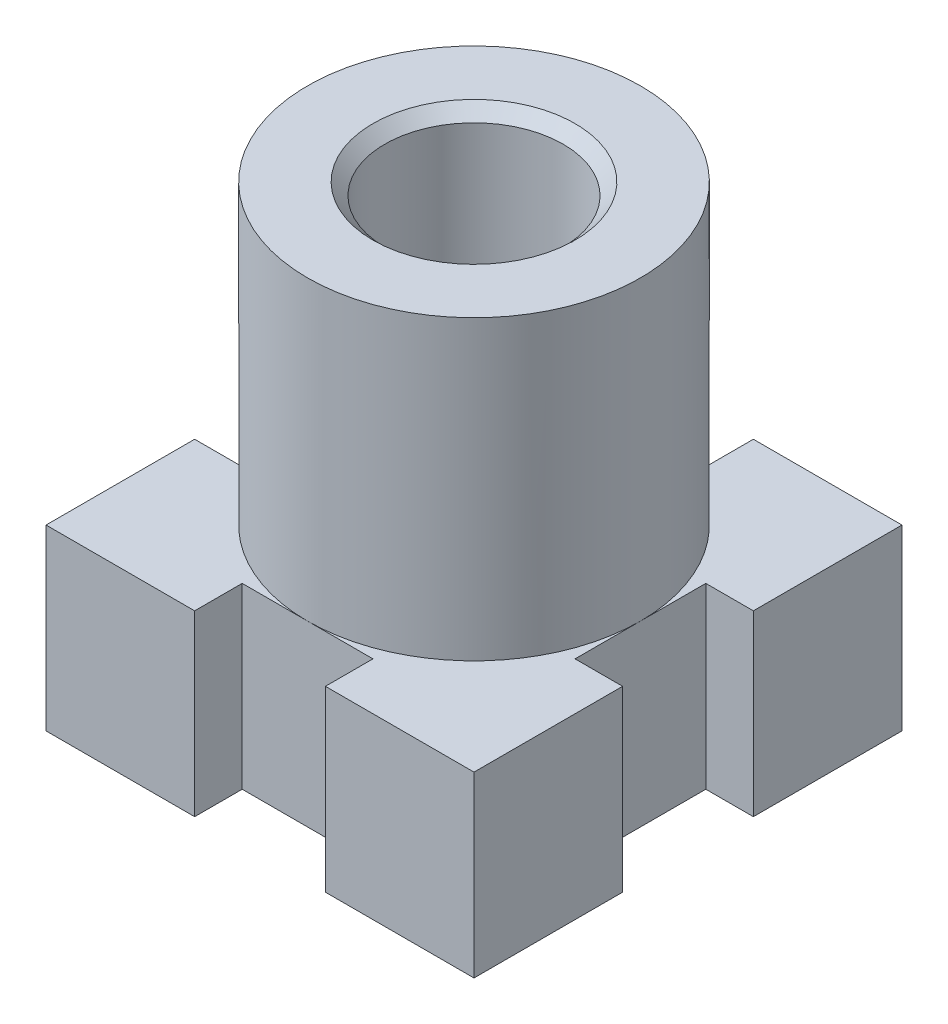
ISO-10303-21;
HEADER;
FILE_DESCRIPTION(('STEP AP214'),'2;1');
FILE_NAME('part.step','',(''),(''),'','','');
FILE_SCHEMA(('AUTOMOTIVE_DESIGN { 1 0 10303 214 1 1 1 1 }'));
ENDSEC;
DATA;
#1=APPLICATION_CONTEXT('core data for automotive mechanical design processes');
#2=APPLICATION_PROTOCOL_DEFINITION('international standard','automotive_design',2000,#1);
#3=PRODUCT_CONTEXT('',#1,'mechanical');
#4=PRODUCT('Part','Part','',(#3));
#5=PRODUCT_RELATED_PRODUCT_CATEGORY('part','',(#4));
#6=PRODUCT_DEFINITION_FORMATION('','',#4);
#7=PRODUCT_DEFINITION_CONTEXT('part definition',#1,'design');
#8=PRODUCT_DEFINITION('design','',#6,#7);
#9=PRODUCT_DEFINITION_SHAPE('','',#8);
#10=(LENGTH_UNIT() NAMED_UNIT(*) SI_UNIT(.MILLI.,.METRE.));
#11=(NAMED_UNIT(*) PLANE_ANGLE_UNIT() SI_UNIT($,.RADIAN.));
#12=(NAMED_UNIT(*) SI_UNIT($,.STERADIAN.) SOLID_ANGLE_UNIT());
#13=UNCERTAINTY_MEASURE_WITH_UNIT(LENGTH_MEASURE(1.E-05),#10,'distance_accuracy_value','');
#14=(GEOMETRIC_REPRESENTATION_CONTEXT(3) GLOBAL_UNCERTAINTY_ASSIGNED_CONTEXT((#13)) GLOBAL_UNIT_ASSIGNED_CONTEXT((#10,
#11,#12)) REPRESENTATION_CONTEXT('',''));
#15=CARTESIAN_POINT('',(0.,0.,0.));
#16=DIRECTION('',(0.,0.,1.));
#17=DIRECTION('',(1.,0.,0.));
#18=AXIS2_PLACEMENT_3D('',#15,#16,#17);
#19=CARTESIAN_POINT('',(0.,7.62,0.));
#20=DIRECTION('',(0.,1.,0.));
#21=DIRECTION('',(0.,0.,1.));
#22=AXIS2_PLACEMENT_3D('',#19,#20,#21);
#23=PLANE('',#22);
#24=CARTESIAN_POINT('',(0.,7.62,0.));
#25=DIRECTION('',(0.,1.,0.));
#26=DIRECTION('',(0.,0.,1.));
#27=AXIS2_PLACEMENT_3D('',#24,#25,#26);
#28=CIRCLE('',#27,7.112);
#29=CARTESIAN_POINT('',(0.,7.62,7.112));
#30=VERTEX_POINT('',#29);
#31=CARTESIAN_POINT('',(7.112,7.62,0.));
#32=VERTEX_POINT('',#31);
#33=EDGE_CURVE('E208',#30,#32,#28,.T.);
#34=ORIENTED_EDGE('',*,*,#33,.F.);
#35=DIRECTION('',(1.,0.,0.));
#36=VECTOR('',#35,1.);
#37=CARTESIAN_POINT('',(2.794,7.62,7.112));
#38=LINE('',#37,#36);
#39=CARTESIAN_POINT('',(2.794,7.62,7.112));
#40=VERTEX_POINT('',#39);
#41=EDGE_CURVE('E197',#30,#40,#38,.T.);
#42=ORIENTED_EDGE('',*,*,#41,.T.);
#43=DIRECTION('',(0.,0.,1.));
#44=VECTOR('',#43,1.);
#45=CARTESIAN_POINT('',(2.794,7.62,9.144));
#46=LINE('',#45,#44);
#47=CARTESIAN_POINT('',(2.794,7.62,9.144));
#48=VERTEX_POINT('',#47);
#49=EDGE_CURVE('E196',#40,#48,#46,.T.);
#50=ORIENTED_EDGE('',*,*,#49,.T.);
#51=DIRECTION('',(1.,0.,0.));
#52=VECTOR('',#51,1.);
#53=CARTESIAN_POINT('',(2.794,7.62,9.144));
#54=LINE('',#53,#52);
#55=CARTESIAN_POINT('',(9.14399999999999,7.62,9.144));
#56=VERTEX_POINT('',#55);
#57=EDGE_CURVE('E256',#48,#56,#54,.T.);
#58=ORIENTED_EDGE('',*,*,#57,.T.);
#59=DIRECTION('',(0.,0.,-1.));
#60=VECTOR('',#59,1.);
#61=CARTESIAN_POINT('',(9.14399999999999,7.62,9.144));
#62=LINE('',#61,#60);
#63=CARTESIAN_POINT('',(9.144,7.62,2.794));
#64=VERTEX_POINT('',#63);
#65=EDGE_CURVE('E258',#56,#64,#62,.T.);
#66=ORIENTED_EDGE('',*,*,#65,.T.);
#67=DIRECTION('',(-1.,0.,0.));
#68=VECTOR('',#67,1.);
#69=CARTESIAN_POINT('',(7.112,7.62,2.794));
#70=LINE('',#69,#68);
#71=CARTESIAN_POINT('',(7.112,7.62,2.794));
#72=VERTEX_POINT('',#71);
#73=EDGE_CURVE('E260',#64,#72,#70,.T.);
#74=ORIENTED_EDGE('',*,*,#73,.T.);
#75=DIRECTION('',(0.,0.,-1.));
#76=VECTOR('',#75,1.);
#77=CARTESIAN_POINT('',(7.112,7.62,-2.794));
#78=LINE('',#77,#76);
#79=EDGE_CURVE('E210',#72,#32,#78,.T.);
#80=ORIENTED_EDGE('',*,*,#79,.T.);
#81=EDGE_LOOP('',(#34,#42,#50,#58,#66,#74,#80));
#82=FACE_BOUND('',#81,.T.);
#83=ADVANCED_FACE('F39',(#82),#23,.T.);
#84=CARTESIAN_POINT('',(0.,7.62,-7.112));
#85=VERTEX_POINT('',#84);
#86=EDGE_CURVE('E55',#32,#85,#28,.T.);
#87=ORIENTED_EDGE('',*,*,#86,.F.);
#88=CARTESIAN_POINT('',(7.112,7.62,-2.794));
#89=VERTEX_POINT('',#88);
#90=EDGE_CURVE('E262',#32,#89,#78,.T.);
#91=ORIENTED_EDGE('',*,*,#90,.T.);
#92=DIRECTION('',(1.,0.,0.));
#93=VECTOR('',#92,1.);
#94=CARTESIAN_POINT('',(9.144,7.62,-2.794));
#95=LINE('',#94,#93);
#96=CARTESIAN_POINT('',(9.144,7.62,-2.794));
#97=VERTEX_POINT('',#96);
#98=EDGE_CURVE('E264',#89,#97,#95,.T.);
#99=ORIENTED_EDGE('',*,*,#98,.T.);
#100=DIRECTION('',(0.,0.,-1.));
#101=VECTOR('',#100,1.);
#102=CARTESIAN_POINT('',(9.144,7.62,-2.794));
#103=LINE('',#102,#101);
#104=CARTESIAN_POINT('',(9.144,7.62,-9.144));
#105=VERTEX_POINT('',#104);
#106=EDGE_CURVE('E225',#97,#105,#103,.T.);
#107=ORIENTED_EDGE('',*,*,#106,.T.);
#108=DIRECTION('',(-1.,0.,0.));
#109=VECTOR('',#108,1.);
#110=CARTESIAN_POINT('',(9.144,7.62,-9.144));
#111=LINE('',#110,#109);
#112=CARTESIAN_POINT('',(2.794,7.62,-9.144));
#113=VERTEX_POINT('',#112);
#114=EDGE_CURVE('E228',#105,#113,#111,.T.);
#115=ORIENTED_EDGE('',*,*,#114,.T.);
#116=DIRECTION('',(0.,0.,1.));
#117=VECTOR('',#116,1.);
#118=CARTESIAN_POINT('',(2.794,7.62,-7.112));
#119=LINE('',#118,#117);
#120=CARTESIAN_POINT('',(2.794,7.62,-7.112));
#121=VERTEX_POINT('',#120);
#122=EDGE_CURVE('E231',#113,#121,#119,.T.);
#123=ORIENTED_EDGE('',*,*,#122,.T.);
#124=DIRECTION('',(-1.,0.,0.));
#125=VECTOR('',#124,1.);
#126=CARTESIAN_POINT('',(-2.794,7.62,-7.112));
#127=LINE('',#126,#125);
#128=EDGE_CURVE('E234',#121,#85,#127,.T.);
#129=ORIENTED_EDGE('',*,*,#128,.T.);
#130=EDGE_LOOP('',(#87,#91,#99,#107,#115,#123,#129));
#131=FACE_BOUND('',#130,.T.);
#132=ADVANCED_FACE('F375',(#131),#23,.T.);
#133=CARTESIAN_POINT('',(-7.112,7.62,0.));
#134=VERTEX_POINT('',#133);
#135=EDGE_CURVE('E217',#85,#134,#28,.T.);
#136=ORIENTED_EDGE('',*,*,#135,.F.);
#137=CARTESIAN_POINT('',(-2.794,7.62,-7.112));
#138=VERTEX_POINT('',#137);
#139=EDGE_CURVE('E233',#85,#138,#127,.T.);
#140=ORIENTED_EDGE('',*,*,#139,.T.);
#141=DIRECTION('',(0.,0.,-1.));
#142=VECTOR('',#141,1.);
#143=CARTESIAN_POINT('',(-2.794,7.62,-9.144));
#144=LINE('',#143,#142);
#145=CARTESIAN_POINT('',(-2.794,7.62,-9.144));
#146=VERTEX_POINT('',#145);
#147=EDGE_CURVE('E236',#138,#146,#144,.T.);
#148=ORIENTED_EDGE('',*,*,#147,.T.);
#149=DIRECTION('',(-1.,0.,0.));
#150=VECTOR('',#149,1.);
#151=CARTESIAN_POINT('',(-2.794,7.62,-9.144));
#152=LINE('',#151,#150);
#153=CARTESIAN_POINT('',(-9.144,7.62,-9.144));
#154=VERTEX_POINT('',#153);
#155=EDGE_CURVE('E238',#146,#154,#152,.T.);
#156=ORIENTED_EDGE('',*,*,#155,.T.);
#157=DIRECTION('',(0.,0.,1.));
#158=VECTOR('',#157,1.);
#159=CARTESIAN_POINT('',(-9.144,7.62,-9.144));
#160=LINE('',#159,#158);
#161=CARTESIAN_POINT('',(-9.144,7.62,-2.794));
#162=VERTEX_POINT('',#161);
#163=EDGE_CURVE('E240',#154,#162,#160,.T.);
#164=ORIENTED_EDGE('',*,*,#163,.T.);
#165=DIRECTION('',(1.,0.,0.));
#166=VECTOR('',#165,1.);
#167=CARTESIAN_POINT('',(-7.112,7.62,-2.794));
#168=LINE('',#167,#166);
#169=CARTESIAN_POINT('',(-7.112,7.62,-2.794));
#170=VERTEX_POINT('',#169);
#171=EDGE_CURVE('E242',#162,#170,#168,.T.);
#172=ORIENTED_EDGE('',*,*,#171,.T.);
#173=DIRECTION('',(0.,0.,1.));
#174=VECTOR('',#173,1.);
#175=CARTESIAN_POINT('',(-7.112,7.62,2.794));
#176=LINE('',#175,#174);
#177=EDGE_CURVE('E245',#170,#134,#176,.T.);
#178=ORIENTED_EDGE('',*,*,#177,.T.);
#179=EDGE_LOOP('',(#136,#140,#148,#156,#164,#172,#178));
#180=FACE_BOUND('',#179,.T.);
#181=ADVANCED_FACE('F372',(#180),#23,.T.);
#182=CARTESIAN_POINT('',(9.144,7.62,-2.794));
#183=DIRECTION('',(-1.,0.,0.));
#184=DIRECTION('',(0.,0.,1.));
#185=AXIS2_PLACEMENT_3D('',#182,#183,#184);
#186=PLANE('',#185);
#187=DIRECTION('',(0.,0.,-1.));
#188=VECTOR('',#187,1.);
#189=CARTESIAN_POINT('',(9.144,0.,-2.794));
#190=LINE('',#189,#188);
#191=CARTESIAN_POINT('',(9.144,0.,-2.794));
#192=VERTEX_POINT('',#191);
#193=CARTESIAN_POINT('',(9.144,0.,-9.144));
#194=VERTEX_POINT('',#193);
#195=EDGE_CURVE('E267',#192,#194,#190,.T.);
#196=ORIENTED_EDGE('',*,*,#195,.T.);
#197=DIRECTION('',(0.,-1.,0.));
#198=VECTOR('',#197,1.);
#199=CARTESIAN_POINT('',(9.144,7.62,-9.144));
#200=LINE('',#199,#198);
#201=EDGE_CURVE('E218',#105,#194,#200,.T.);
#202=ORIENTED_EDGE('',*,*,#201,.F.);
#203=ORIENTED_EDGE('',*,*,#106,.F.);
#204=DIRECTION('',(0.,-1.,0.));
#205=VECTOR('',#204,1.);
#206=CARTESIAN_POINT('',(9.144,7.62,-2.794));
#207=LINE('',#206,#205);
#208=EDGE_CURVE('E266',#97,#192,#207,.T.);
#209=ORIENTED_EDGE('',*,*,#208,.T.);
#210=EDGE_LOOP('',(#196,#202,#203,#209));
#211=FACE_BOUND('',#210,.T.);
#212=ADVANCED_FACE('F463',(#211),#186,.F.);
#213=CARTESIAN_POINT('',(9.144,7.62,-9.144));
#214=DIRECTION('',(0.,0.,1.));
#215=DIRECTION('',(1.,0.,0.));
#216=AXIS2_PLACEMENT_3D('',#213,#214,#215);
#217=PLANE('',#216);
#218=DIRECTION('',(-1.,0.,0.));
#219=VECTOR('',#218,1.);
#220=CARTESIAN_POINT('',(9.144,0.,-9.144));
#221=LINE('',#220,#219);
#222=CARTESIAN_POINT('',(2.794,0.,-9.144));
#223=VERTEX_POINT('',#222);
#224=EDGE_CURVE('E270',#194,#223,#221,.T.);
#225=ORIENTED_EDGE('',*,*,#224,.T.);
#226=DIRECTION('',(0.,-1.,0.));
#227=VECTOR('',#226,1.);
#228=CARTESIAN_POINT('',(2.794,7.62,-9.144));
#229=LINE('',#228,#227);
#230=EDGE_CURVE('E220',#113,#223,#229,.T.);
#231=ORIENTED_EDGE('',*,*,#230,.F.);
#232=ORIENTED_EDGE('',*,*,#114,.F.);
#233=ORIENTED_EDGE('',*,*,#201,.T.);
#234=EDGE_LOOP('',(#225,#231,#232,#233));
#235=FACE_BOUND('',#234,.T.);
#236=ADVANCED_FACE('F460',(#235),#217,.F.);
#237=CARTESIAN_POINT('',(2.794,7.62,-7.112));
#238=DIRECTION('',(1.,0.,0.));
#239=DIRECTION('',(0.,0.,-1.));
#240=AXIS2_PLACEMENT_3D('',#237,#238,#239);
#241=PLANE('',#240);
#242=DIRECTION('',(0.,0.,1.));
#243=VECTOR('',#242,1.);
#244=CARTESIAN_POINT('',(2.794,0.,-7.112));
#245=LINE('',#244,#243);
#246=CARTESIAN_POINT('',(2.794,0.,-7.112));
#247=VERTEX_POINT('',#246);
#248=EDGE_CURVE('E272',#223,#247,#245,.T.);
#249=ORIENTED_EDGE('',*,*,#248,.T.);
#250=DIRECTION('',(0.,-1.,0.));
#251=VECTOR('',#250,1.);
#252=CARTESIAN_POINT('',(2.794,7.62,-7.112));
#253=LINE('',#252,#251);
#254=EDGE_CURVE('E354',#121,#247,#253,.T.);
#255=ORIENTED_EDGE('',*,*,#254,.F.);
#256=ORIENTED_EDGE('',*,*,#122,.F.);
#257=ORIENTED_EDGE('',*,*,#230,.T.);
#258=EDGE_LOOP('',(#249,#255,#256,#257));
#259=FACE_BOUND('',#258,.T.);
#260=ADVANCED_FACE('F456',(#259),#241,.F.);
#261=CARTESIAN_POINT('',(-2.794,7.62,-7.112));
#262=DIRECTION('',(0.,0.,1.));
#263=DIRECTION('',(1.,0.,0.));
#264=AXIS2_PLACEMENT_3D('',#261,#262,#263);
#265=PLANE('',#264);
#266=DIRECTION('',(-1.,0.,0.));
#267=VECTOR('',#266,1.);
#268=CARTESIAN_POINT('',(-2.794,0.,-7.112));
#269=LINE('',#268,#267);
#270=CARTESIAN_POINT('',(-2.794,0.,-7.112));
#271=VERTEX_POINT('',#270);
#272=EDGE_CURVE('E274',#247,#271,#269,.T.);
#273=ORIENTED_EDGE('',*,*,#272,.T.);
#274=DIRECTION('',(0.,-1.,0.));
#275=VECTOR('',#274,1.);
#276=CARTESIAN_POINT('',(-2.794,7.62,-7.112));
#277=LINE('',#276,#275);
#278=EDGE_CURVE('E351',#138,#271,#277,.T.);
#279=ORIENTED_EDGE('',*,*,#278,.F.);
#280=ORIENTED_EDGE('',*,*,#139,.F.);
#281=ORIENTED_EDGE('',*,*,#128,.F.);
#282=ORIENTED_EDGE('',*,*,#254,.T.);
#283=EDGE_LOOP('',(#273,#279,#280,#281,#282));
#284=FACE_BOUND('',#283,.T.);
#285=ADVANCED_FACE('F452',(#284),#265,.F.);
#286=CARTESIAN_POINT('',(-2.794,7.62,-9.144));
#287=DIRECTION('',(-1.,0.,0.));
#288=DIRECTION('',(0.,0.,1.));
#289=AXIS2_PLACEMENT_3D('',#286,#287,#288);
#290=PLANE('',#289);
#291=DIRECTION('',(0.,0.,-1.));
#292=VECTOR('',#291,1.);
#293=CARTESIAN_POINT('',(-2.794,0.,-9.144));
#294=LINE('',#293,#292);
#295=CARTESIAN_POINT('',(-2.794,0.,-9.144));
#296=VERTEX_POINT('',#295);
#297=EDGE_CURVE('E276',#271,#296,#294,.T.);
#298=ORIENTED_EDGE('',*,*,#297,.T.);
#299=DIRECTION('',(0.,-1.,0.));
#300=VECTOR('',#299,1.);
#301=CARTESIAN_POINT('',(-2.794,7.62,-9.144));
#302=LINE('',#301,#300);
#303=EDGE_CURVE('E348',#146,#296,#302,.T.);
#304=ORIENTED_EDGE('',*,*,#303,.F.);
#305=ORIENTED_EDGE('',*,*,#147,.F.);
#306=ORIENTED_EDGE('',*,*,#278,.T.);
#307=EDGE_LOOP('',(#298,#304,#305,#306));
#308=FACE_BOUND('',#307,.T.);
#309=ADVANCED_FACE('F448',(#308),#290,.F.);
#310=CARTESIAN_POINT('',(-2.794,7.62,-9.144));
#311=DIRECTION('',(0.,0.,1.));
#312=DIRECTION('',(1.,0.,0.));
#313=AXIS2_PLACEMENT_3D('',#310,#311,#312);
#314=PLANE('',#313);
#315=DIRECTION('',(-1.,0.,0.));
#316=VECTOR('',#315,1.);
#317=CARTESIAN_POINT('',(-2.794,0.,-9.144));
#318=LINE('',#317,#316);
#319=CARTESIAN_POINT('',(-9.144,0.,-9.144));
#320=VERTEX_POINT('',#319);
#321=EDGE_CURVE('E278',#296,#320,#318,.T.);
#322=ORIENTED_EDGE('',*,*,#321,.T.);
#323=DIRECTION('',(0.,-1.,0.));
#324=VECTOR('',#323,1.);
#325=CARTESIAN_POINT('',(-9.144,7.62,-9.144));
#326=LINE('',#325,#324);
#327=EDGE_CURVE('E345',#154,#320,#326,.T.);
#328=ORIENTED_EDGE('',*,*,#327,.F.);
#329=ORIENTED_EDGE('',*,*,#155,.F.);
#330=ORIENTED_EDGE('',*,*,#303,.T.);
#331=EDGE_LOOP('',(#322,#328,#329,#330));
#332=FACE_BOUND('',#331,.T.);
#333=ADVANCED_FACE('F444',(#332),#314,.F.);
#334=CARTESIAN_POINT('',(-9.144,7.62,-9.144));
#335=DIRECTION('',(1.,0.,0.));
#336=DIRECTION('',(0.,0.,-1.));
#337=AXIS2_PLACEMENT_3D('',#334,#335,#336);
#338=PLANE('',#337);
#339=DIRECTION('',(0.,0.,1.));
#340=VECTOR('',#339,1.);
#341=CARTESIAN_POINT('',(-9.144,0.,-9.144));
#342=LINE('',#341,#340);
#343=CARTESIAN_POINT('',(-9.144,0.,-2.794));
#344=VERTEX_POINT('',#343);
#345=EDGE_CURVE('E280',#320,#344,#342,.T.);
#346=ORIENTED_EDGE('',*,*,#345,.T.);
#347=DIRECTION('',(0.,-1.,0.));
#348=VECTOR('',#347,1.);
#349=CARTESIAN_POINT('',(-9.144,7.62,-2.794));
#350=LINE('',#349,#348);
#351=EDGE_CURVE('E342',#162,#344,#350,.T.);
#352=ORIENTED_EDGE('',*,*,#351,.F.);
#353=ORIENTED_EDGE('',*,*,#163,.F.);
#354=ORIENTED_EDGE('',*,*,#327,.T.);
#355=EDGE_LOOP('',(#346,#352,#353,#354));
#356=FACE_BOUND('',#355,.T.);
#357=ADVANCED_FACE('F440',(#356),#338,.F.);
#358=CARTESIAN_POINT('',(-7.112,7.62,-2.794));
#359=DIRECTION('',(0.,0.,-1.));
#360=DIRECTION('',(-1.,0.,0.));
#361=AXIS2_PLACEMENT_3D('',#358,#359,#360);
#362=PLANE('',#361);
#363=DIRECTION('',(1.,0.,0.));
#364=VECTOR('',#363,1.);
#365=CARTESIAN_POINT('',(-7.112,0.,-2.794));
#366=LINE('',#365,#364);
#367=CARTESIAN_POINT('',(-7.112,0.,-2.794));
#368=VERTEX_POINT('',#367);
#369=EDGE_CURVE('E282',#344,#368,#366,.T.);
#370=ORIENTED_EDGE('',*,*,#369,.T.);
#371=DIRECTION('',(0.,-1.,0.));
#372=VECTOR('',#371,1.);
#373=CARTESIAN_POINT('',(-7.112,7.62,-2.794));
#374=LINE('',#373,#372);
#375=EDGE_CURVE('E339',#170,#368,#374,.T.);
#376=ORIENTED_EDGE('',*,*,#375,.F.);
#377=ORIENTED_EDGE('',*,*,#171,.F.);
#378=ORIENTED_EDGE('',*,*,#351,.T.);
#379=EDGE_LOOP('',(#370,#376,#377,#378));
#380=FACE_BOUND('',#379,.T.);
#381=ADVANCED_FACE('F436',(#380),#362,.F.);
#382=CARTESIAN_POINT('',(-7.112,7.62,2.794));
#383=DIRECTION('',(1.,0.,0.));
#384=DIRECTION('',(0.,0.,-1.));
#385=AXIS2_PLACEMENT_3D('',#382,#383,#384);
#386=PLANE('',#385);
#387=DIRECTION('',(0.,0.,1.));
#388=VECTOR('',#387,1.);
#389=CARTESIAN_POINT('',(-7.112,0.,2.794));
#390=LINE('',#389,#388);
#391=CARTESIAN_POINT('',(-7.112,0.,2.794));
#392=VERTEX_POINT('',#391);
#393=EDGE_CURVE('E284',#368,#392,#390,.T.);
#394=ORIENTED_EDGE('',*,*,#393,.T.);
#395=DIRECTION('',(0.,-1.,0.));
#396=VECTOR('',#395,1.);
#397=CARTESIAN_POINT('',(-7.112,7.62,2.794));
#398=LINE('',#397,#396);
#399=CARTESIAN_POINT('',(-7.112,7.62,2.794));
#400=VERTEX_POINT('',#399);
#401=EDGE_CURVE('E336',#400,#392,#398,.T.);
#402=ORIENTED_EDGE('',*,*,#401,.F.);
#403=EDGE_CURVE('E244',#134,#400,#176,.T.);
#404=ORIENTED_EDGE('',*,*,#403,.F.);
#405=ORIENTED_EDGE('',*,*,#177,.F.);
#406=ORIENTED_EDGE('',*,*,#375,.T.);
#407=EDGE_LOOP('',(#394,#402,#404,#405,#406));
#408=FACE_BOUND('',#407,.T.);
#409=ADVANCED_FACE('F432',(#408),#386,.F.);
#410=CARTESIAN_POINT('',(-9.14399999999999,7.62,2.794));
#411=DIRECTION('',(0.,0.,1.));
#412=DIRECTION('',(1.,0.,0.));
#413=AXIS2_PLACEMENT_3D('',#410,#411,#412);
#414=PLANE('',#413);
#415=DIRECTION('',(-1.,0.,0.));
#416=VECTOR('',#415,1.);
#417=CARTESIAN_POINT('',(-9.14399999999999,0.,2.794));
#418=LINE('',#417,#416);
#419=CARTESIAN_POINT('',(-9.14399999999999,0.,2.794));
#420=VERTEX_POINT('',#419);
#421=EDGE_CURVE('E286',#392,#420,#418,.T.);
#422=ORIENTED_EDGE('',*,*,#421,.T.);
#423=DIRECTION('',(0.,-1.,0.));
#424=VECTOR('',#423,1.);
#425=CARTESIAN_POINT('',(-9.14399999999999,7.62,2.794));
#426=LINE('',#425,#424);
#427=CARTESIAN_POINT('',(-9.14399999999999,7.62,2.794));
#428=VERTEX_POINT('',#427);
#429=EDGE_CURVE('E333',#428,#420,#426,.T.);
#430=ORIENTED_EDGE('',*,*,#429,.F.);
#431=DIRECTION('',(-1.,0.,0.));
#432=VECTOR('',#431,1.);
#433=CARTESIAN_POINT('',(-9.14399999999999,7.62,2.794));
#434=LINE('',#433,#432);
#435=EDGE_CURVE('E248',#400,#428,#434,.T.);
#436=ORIENTED_EDGE('',*,*,#435,.F.);
#437=ORIENTED_EDGE('',*,*,#401,.T.);
#438=EDGE_LOOP('',(#422,#430,#436,#437));
#439=FACE_BOUND('',#438,.T.);
#440=ADVANCED_FACE('F428',(#439),#414,.F.);
#441=CARTESIAN_POINT('',(-9.14399999999999,7.62,2.794));
#442=DIRECTION('',(1.,0.,0.));
#443=DIRECTION('',(0.,0.,-1.));
#444=AXIS2_PLACEMENT_3D('',#441,#442,#443);
#445=PLANE('',#444);
#446=DIRECTION('',(0.,0.,1.));
#447=VECTOR('',#446,1.);
#448=CARTESIAN_POINT('',(-9.14399999999999,0.,2.794));
#449=LINE('',#448,#447);
#450=CARTESIAN_POINT('',(-9.14399999999999,0.,9.144));
#451=VERTEX_POINT('',#450);
#452=EDGE_CURVE('E288',#420,#451,#449,.T.);
#453=ORIENTED_EDGE('',*,*,#452,.T.);
#454=DIRECTION('',(0.,-1.,0.));
#455=VECTOR('',#454,1.);
#456=CARTESIAN_POINT('',(-9.14399999999999,7.62,9.144));
#457=LINE('',#456,#455);
#458=CARTESIAN_POINT('',(-9.14399999999999,7.62,9.144));
#459=VERTEX_POINT('',#458);
#460=EDGE_CURVE('E330',#459,#451,#457,.T.);
#461=ORIENTED_EDGE('',*,*,#460,.F.);
#462=DIRECTION('',(0.,0.,1.));
#463=VECTOR('',#462,1.);
#464=CARTESIAN_POINT('',(-9.14399999999999,7.62,2.794));
#465=LINE('',#464,#463);
#466=EDGE_CURVE('E250',#428,#459,#465,.T.);
#467=ORIENTED_EDGE('',*,*,#466,.F.);
#468=ORIENTED_EDGE('',*,*,#429,.T.);
#469=EDGE_LOOP('',(#453,#461,#467,#468));
#470=FACE_BOUND('',#469,.T.);
#471=ADVANCED_FACE('F424',(#470),#445,.F.);
#472=CARTESIAN_POINT('',(-9.14399999999999,7.62,9.144));
#473=DIRECTION('',(0.,0.,-1.));
#474=DIRECTION('',(-1.,0.,0.));
#475=AXIS2_PLACEMENT_3D('',#472,#473,#474);
#476=PLANE('',#475);
#477=DIRECTION('',(1.,0.,0.));
#478=VECTOR('',#477,1.);
#479=CARTESIAN_POINT('',(-9.14399999999999,0.,9.144));
#480=LINE('',#479,#478);
#481=CARTESIAN_POINT('',(-2.794,0.,9.144));
#482=VERTEX_POINT('',#481);
#483=EDGE_CURVE('E290',#451,#482,#480,.T.);
#484=ORIENTED_EDGE('',*,*,#483,.T.);
#485=DIRECTION('',(0.,-1.,0.));
#486=VECTOR('',#485,1.);
#487=CARTESIAN_POINT('',(-2.794,7.62,9.144));
#488=LINE('',#487,#486);
#489=CARTESIAN_POINT('',(-2.794,7.62,9.144));
#490=VERTEX_POINT('',#489);
#491=EDGE_CURVE('E327',#490,#482,#488,.T.);
#492=ORIENTED_EDGE('',*,*,#491,.F.);
#493=DIRECTION('',(1.,0.,0.));
#494=VECTOR('',#493,1.);
#495=CARTESIAN_POINT('',(-9.14399999999999,7.62,9.144));
#496=LINE('',#495,#494);
#497=EDGE_CURVE('E252',#459,#490,#496,.T.);
#498=ORIENTED_EDGE('',*,*,#497,.F.);
#499=ORIENTED_EDGE('',*,*,#460,.T.);
#500=EDGE_LOOP('',(#484,#492,#498,#499));
#501=FACE_BOUND('',#500,.T.);
#502=ADVANCED_FACE('F420',(#501),#476,.F.);
#503=CARTESIAN_POINT('',(-2.794,7.62,7.112));
#504=DIRECTION('',(-1.,0.,0.));
#505=DIRECTION('',(0.,0.,1.));
#506=AXIS2_PLACEMENT_3D('',#503,#504,#505);
#507=PLANE('',#506);
#508=DIRECTION('',(0.,0.,-1.));
#509=VECTOR('',#508,1.);
#510=CARTESIAN_POINT('',(-2.794,0.,7.112));
#511=LINE('',#510,#509);
#512=CARTESIAN_POINT('',(-2.794,0.,7.112));
#513=VERTEX_POINT('',#512);
#514=EDGE_CURVE('E292',#482,#513,#511,.T.);
#515=ORIENTED_EDGE('',*,*,#514,.T.);
#516=DIRECTION('',(0.,-1.,0.));
#517=VECTOR('',#516,1.);
#518=CARTESIAN_POINT('',(-2.794,7.62,7.112));
#519=LINE('',#518,#517);
#520=CARTESIAN_POINT('',(-2.794,7.62,7.112));
#521=VERTEX_POINT('',#520);
#522=EDGE_CURVE('E325',#521,#513,#519,.T.);
#523=ORIENTED_EDGE('',*,*,#522,.F.);
#524=DIRECTION('',(0.,0.,-1.));
#525=VECTOR('',#524,1.);
#526=CARTESIAN_POINT('',(-2.794,7.62,7.112));
#527=LINE('',#526,#525);
#528=EDGE_CURVE('E192',#490,#521,#527,.T.);
#529=ORIENTED_EDGE('',*,*,#528,.F.);
#530=ORIENTED_EDGE('',*,*,#491,.T.);
#531=EDGE_LOOP('',(#515,#523,#529,#530));
#532=FACE_BOUND('',#531,.T.);
#533=ADVANCED_FACE('F417',(#532),#507,.F.);
#534=CARTESIAN_POINT('',(2.794,7.62,7.112));
#535=DIRECTION('',(0.,0.,-1.));
#536=DIRECTION('',(-1.,0.,0.));
#537=AXIS2_PLACEMENT_3D('',#534,#535,#536);
#538=PLANE('',#537);
#539=DIRECTION('',(1.,0.,0.));
#540=VECTOR('',#539,1.);
#541=CARTESIAN_POINT('',(2.794,0.,7.112));
#542=LINE('',#541,#540);
#543=CARTESIAN_POINT('',(2.794,0.,7.112));
#544=VERTEX_POINT('',#543);
#545=EDGE_CURVE('E294',#513,#544,#542,.T.);
#546=ORIENTED_EDGE('',*,*,#545,.T.);
#547=DIRECTION('',(0.,-1.,0.));
#548=VECTOR('',#547,1.);
#549=CARTESIAN_POINT('',(2.794,7.62,7.112));
#550=LINE('',#549,#548);
#551=EDGE_CURVE('E203',#40,#544,#550,.T.);
#552=ORIENTED_EDGE('',*,*,#551,.F.);
#553=ORIENTED_EDGE('',*,*,#41,.F.);
#554=EDGE_CURVE('E188',#521,#30,#38,.T.);
#555=ORIENTED_EDGE('',*,*,#554,.F.);
#556=ORIENTED_EDGE('',*,*,#522,.T.);
#557=EDGE_LOOP('',(#546,#552,#553,#555,#556));
#558=FACE_BOUND('',#557,.T.);
#559=ADVANCED_FACE('F201',(#558),#538,.F.);
#560=CARTESIAN_POINT('',(2.794,7.62,9.144));
#561=DIRECTION('',(1.,0.,0.));
#562=DIRECTION('',(0.,0.,-1.));
#563=AXIS2_PLACEMENT_3D('',#560,#561,#562);
#564=PLANE('',#563);
#565=DIRECTION('',(0.,0.,1.));
#566=VECTOR('',#565,1.);
#567=CARTESIAN_POINT('',(2.794,0.,9.144));
#568=LINE('',#567,#566);
#569=CARTESIAN_POINT('',(2.794,0.,9.144));
#570=VERTEX_POINT('',#569);
#571=EDGE_CURVE('E296',#544,#570,#568,.T.);
#572=ORIENTED_EDGE('',*,*,#571,.T.);
#573=DIRECTION('',(0.,-1.,0.));
#574=VECTOR('',#573,1.);
#575=CARTESIAN_POINT('',(2.794,7.62,9.144));
#576=LINE('',#575,#574);
#577=EDGE_CURVE('E321',#48,#570,#576,.T.);
#578=ORIENTED_EDGE('',*,*,#577,.F.);
#579=ORIENTED_EDGE('',*,*,#49,.F.);
#580=ORIENTED_EDGE('',*,*,#551,.T.);
#581=EDGE_LOOP('',(#572,#578,#579,#580));
#582=FACE_BOUND('',#581,.T.);
#583=ADVANCED_FACE('F410',(#582),#564,.F.);
#584=CARTESIAN_POINT('',(2.794,7.62,9.144));
#585=DIRECTION('',(0.,0.,-1.));
#586=DIRECTION('',(-1.,0.,0.));
#587=AXIS2_PLACEMENT_3D('',#584,#585,#586);
#588=PLANE('',#587);
#589=DIRECTION('',(1.,0.,0.));
#590=VECTOR('',#589,1.);
#591=CARTESIAN_POINT('',(2.794,0.,9.144));
#592=LINE('',#591,#590);
#593=CARTESIAN_POINT('',(9.14399999999999,0.,9.144));
#594=VERTEX_POINT('',#593);
#595=EDGE_CURVE('E298',#570,#594,#592,.T.);
#596=ORIENTED_EDGE('',*,*,#595,.T.);
#597=DIRECTION('',(0.,-1.,0.));
#598=VECTOR('',#597,1.);
#599=CARTESIAN_POINT('',(9.14399999999999,7.62,9.144));
#600=LINE('',#599,#598);
#601=EDGE_CURVE('E318',#56,#594,#600,.T.);
#602=ORIENTED_EDGE('',*,*,#601,.F.);
#603=ORIENTED_EDGE('',*,*,#57,.F.);
#604=ORIENTED_EDGE('',*,*,#577,.T.);
#605=EDGE_LOOP('',(#596,#602,#603,#604));
#606=FACE_BOUND('',#605,.T.);
#607=ADVANCED_FACE('F406',(#606),#588,.F.);
#608=CARTESIAN_POINT('',(9.14399999999999,7.62,9.144));
#609=DIRECTION('',(-1.,0.,0.));
#610=DIRECTION('',(0.,0.,1.));
#611=AXIS2_PLACEMENT_3D('',#608,#609,#610);
#612=PLANE('',#611);
#613=DIRECTION('',(0.,0.,-1.));
#614=VECTOR('',#613,1.);
#615=CARTESIAN_POINT('',(9.14399999999999,0.,9.144));
#616=LINE('',#615,#614);
#617=CARTESIAN_POINT('',(9.144,0.,2.794));
#618=VERTEX_POINT('',#617);
#619=EDGE_CURVE('E300',#594,#618,#616,.T.);
#620=ORIENTED_EDGE('',*,*,#619,.T.);
#621=DIRECTION('',(0.,-1.,0.));
#622=VECTOR('',#621,1.);
#623=CARTESIAN_POINT('',(9.144,7.62,2.794));
#624=LINE('',#623,#622);
#625=EDGE_CURVE('E315',#64,#618,#624,.T.);
#626=ORIENTED_EDGE('',*,*,#625,.F.);
#627=ORIENTED_EDGE('',*,*,#65,.F.);
#628=ORIENTED_EDGE('',*,*,#601,.T.);
#629=EDGE_LOOP('',(#620,#626,#627,#628));
#630=FACE_BOUND('',#629,.T.);
#631=ADVANCED_FACE('F402',(#630),#612,.F.);
#632=CARTESIAN_POINT('',(7.112,7.62,2.794));
#633=DIRECTION('',(0.,0.,1.));
#634=DIRECTION('',(1.,0.,0.));
#635=AXIS2_PLACEMENT_3D('',#632,#633,#634);
#636=PLANE('',#635);
#637=DIRECTION('',(-1.,0.,0.));
#638=VECTOR('',#637,1.);
#639=CARTESIAN_POINT('',(7.112,0.,2.794));
#640=LINE('',#639,#638);
#641=CARTESIAN_POINT('',(7.112,0.,2.794));
#642=VERTEX_POINT('',#641);
#643=EDGE_CURVE('E302',#618,#642,#640,.T.);
#644=ORIENTED_EDGE('',*,*,#643,.T.);
#645=DIRECTION('',(0.,-1.,0.));
#646=VECTOR('',#645,1.);
#647=CARTESIAN_POINT('',(7.112,7.62,2.794));
#648=LINE('',#647,#646);
#649=EDGE_CURVE('E312',#72,#642,#648,.T.);
#650=ORIENTED_EDGE('',*,*,#649,.F.);
#651=ORIENTED_EDGE('',*,*,#73,.F.);
#652=ORIENTED_EDGE('',*,*,#625,.T.);
#653=EDGE_LOOP('',(#644,#650,#651,#652));
#654=FACE_BOUND('',#653,.T.);
#655=ADVANCED_FACE('F396',(#654),#636,.F.);
#656=CARTESIAN_POINT('',(7.112,7.62,-2.794));
#657=DIRECTION('',(-1.,0.,0.));
#658=DIRECTION('',(0.,0.,1.));
#659=AXIS2_PLACEMENT_3D('',#656,#657,#658);
#660=PLANE('',#659);
#661=DIRECTION('',(0.,0.,-1.));
#662=VECTOR('',#661,1.);
#663=CARTESIAN_POINT('',(7.112,0.,-2.794));
#664=LINE('',#663,#662);
#665=CARTESIAN_POINT('',(7.112,0.,-2.794));
#666=VERTEX_POINT('',#665);
#667=EDGE_CURVE('E304',#642,#666,#664,.T.);
#668=ORIENTED_EDGE('',*,*,#667,.T.);
#669=DIRECTION('',(0.,-1.,0.));
#670=VECTOR('',#669,1.);
#671=CARTESIAN_POINT('',(7.112,7.62,-2.794));
#672=LINE('',#671,#670);
#673=EDGE_CURVE('E309',#89,#666,#672,.T.);
#674=ORIENTED_EDGE('',*,*,#673,.F.);
#675=ORIENTED_EDGE('',*,*,#90,.F.);
#676=ORIENTED_EDGE('',*,*,#79,.F.);
#677=ORIENTED_EDGE('',*,*,#649,.T.);
#678=EDGE_LOOP('',(#668,#674,#675,#676,#677));
#679=FACE_BOUND('',#678,.T.);
#680=ADVANCED_FACE('F390',(#679),#660,.F.);
#681=CARTESIAN_POINT('',(9.144,7.62,-2.794));
#682=DIRECTION('',(0.,0.,-1.));
#683=DIRECTION('',(-1.,0.,0.));
#684=AXIS2_PLACEMENT_3D('',#681,#682,#683);
#685=PLANE('',#684);
#686=DIRECTION('',(1.,0.,0.));
#687=VECTOR('',#686,1.);
#688=CARTESIAN_POINT('',(9.144,0.,-2.794));
#689=LINE('',#688,#687);
#690=EDGE_CURVE('E229',#666,#192,#689,.T.);
#691=ORIENTED_EDGE('',*,*,#690,.T.);
#692=ORIENTED_EDGE('',*,*,#208,.F.);
#693=ORIENTED_EDGE('',*,*,#98,.F.);
#694=ORIENTED_EDGE('',*,*,#673,.T.);
#695=EDGE_LOOP('',(#691,#692,#693,#694));
#696=FACE_BOUND('',#695,.T.);
#697=ADVANCED_FACE('F383',(#696),#685,.F.);
#698=EDGE_CURVE('E63',#134,#30,#28,.T.);
#699=ORIENTED_EDGE('',*,*,#698,.F.);
#700=ORIENTED_EDGE('',*,*,#403,.T.);
#701=ORIENTED_EDGE('',*,*,#435,.T.);
#702=ORIENTED_EDGE('',*,*,#466,.T.);
#703=ORIENTED_EDGE('',*,*,#497,.T.);
#704=ORIENTED_EDGE('',*,*,#528,.T.);
#705=ORIENTED_EDGE('',*,*,#554,.T.);
#706=EDGE_LOOP('',(#699,#700,#701,#702,#703,#704,#705));
#707=FACE_BOUND('',#706,.T.);
#708=ADVANCED_FACE('F190',(#707),#23,.T.);
#709=CARTESIAN_POINT('',(0.,0.,0.));
#710=DIRECTION('',(0.,1.,0.));
#711=DIRECTION('',(0.,0.,1.));
#712=AXIS2_PLACEMENT_3D('',#709,#710,#711);
#713=PLANE('',#712);
#714=ORIENTED_EDGE('',*,*,#195,.F.);
#715=ORIENTED_EDGE('',*,*,#690,.F.);
#716=ORIENTED_EDGE('',*,*,#667,.F.);
#717=ORIENTED_EDGE('',*,*,#643,.F.);
#718=ORIENTED_EDGE('',*,*,#619,.F.);
#719=ORIENTED_EDGE('',*,*,#595,.F.);
#720=ORIENTED_EDGE('',*,*,#571,.F.);
#721=ORIENTED_EDGE('',*,*,#545,.F.);
#722=ORIENTED_EDGE('',*,*,#514,.F.);
#723=ORIENTED_EDGE('',*,*,#483,.F.);
#724=ORIENTED_EDGE('',*,*,#452,.F.);
#725=ORIENTED_EDGE('',*,*,#421,.F.);
#726=ORIENTED_EDGE('',*,*,#393,.F.);
#727=ORIENTED_EDGE('',*,*,#369,.F.);
#728=ORIENTED_EDGE('',*,*,#345,.F.);
#729=ORIENTED_EDGE('',*,*,#321,.F.);
#730=ORIENTED_EDGE('',*,*,#297,.F.);
#731=ORIENTED_EDGE('',*,*,#272,.F.);
#732=ORIENTED_EDGE('',*,*,#248,.F.);
#733=ORIENTED_EDGE('',*,*,#224,.F.);
#734=EDGE_LOOP('',(#714,#715,#716,#717,#718,#719,#720,#721,#722,#723,#724,#725,#726,#727,#728,
#729,#730,#731,#732,#733));
#735=FACE_BOUND('',#734,.T.);
#736=ADVANCED_FACE('F382',(#735),#713,.F.);
#737=CARTESIAN_POINT('',(0.,20.32,0.));
#738=DIRECTION('',(0.,1.,0.));
#739=DIRECTION('',(0.,0.,1.));
#740=AXIS2_PLACEMENT_3D('',#737,#738,#739);
#741=PLANE('',#740);
#742=CARTESIAN_POINT('',(0.,20.32,0.));
#743=DIRECTION('',(0.,1.,0.));
#744=DIRECTION('',(0.,0.,1.));
#745=AXIS2_PLACEMENT_3D('',#742,#743,#744);
#746=CIRCLE('',#745,4.318);
#747=CARTESIAN_POINT('',(0.,20.32,4.318));
#748=VERTEX_POINT('',#747);
#749=EDGE_CURVE('E11',#748,#748,#746,.F.);
#750=ORIENTED_EDGE('',*,*,#749,.T.);
#751=EDGE_LOOP('',(#750));
#752=FACE_BOUND('',#751,.T.);
#753=CARTESIAN_POINT('',(0.,20.32,0.));
#754=DIRECTION('',(0.,1.,0.));
#755=DIRECTION('',(0.,0.,1.));
#756=AXIS2_PLACEMENT_3D('',#753,#754,#755);
#757=CIRCLE('',#756,7.112);
#758=CARTESIAN_POINT('',(0.,20.32,7.112));
#759=VERTEX_POINT('',#758);
#760=EDGE_CURVE('E212',#759,#759,#757,.T.);
#761=ORIENTED_EDGE('',*,*,#760,.T.);
#762=EDGE_LOOP('',(#761));
#763=FACE_BOUND('',#762,.T.);
#764=ADVANCED_FACE('F388',(#752,#763),#741,.T.);
#765=CARTESIAN_POINT('',(0.,20.32,0.));
#766=DIRECTION('',(0.,-1.,0.));
#767=DIRECTION('',(0.,0.,-1.));
#768=AXIS2_PLACEMENT_3D('',#765,#766,#767);
#769=CYLINDRICAL_SURFACE('',#768,7.112);
#770=ORIENTED_EDGE('',*,*,#760,.F.);
#771=EDGE_LOOP('',(#770));
#772=FACE_BOUND('',#771,.T.);
#773=ORIENTED_EDGE('',*,*,#33,.T.);
#774=ORIENTED_EDGE('',*,*,#86,.T.);
#775=ORIENTED_EDGE('',*,*,#135,.T.);
#776=ORIENTED_EDGE('',*,*,#698,.T.);
#777=EDGE_LOOP('',(#773,#774,#775,#776));
#778=FACE_BOUND('',#777,.T.);
#779=ADVANCED_FACE('F216',(#772,#778),#769,.T.);
#780=CARTESIAN_POINT('',(0.,20.32,0.));
#781=DIRECTION('',(0.,-1.,0.));
#782=DIRECTION('',(0.,0.,-1.));
#783=AXIS2_PLACEMENT_3D('',#780,#781,#782);
#784=CYLINDRICAL_SURFACE('',#783,3.81);
#785=CARTESIAN_POINT('',(0.,19.812,0.));
#786=DIRECTION('',(0.,1.,0.));
#787=DIRECTION('',(0.,0.,1.));
#788=AXIS2_PLACEMENT_3D('',#785,#786,#787);
#789=CIRCLE('',#788,3.81);
#790=CARTESIAN_POINT('',(0.,19.812,3.81));
#791=VERTEX_POINT('',#790);
#792=EDGE_CURVE('E48',#791,#791,#789,.T.);
#793=ORIENTED_EDGE('',*,*,#792,.T.);
#794=EDGE_LOOP('',(#793));
#795=FACE_BOUND('',#794,.T.);
#796=CARTESIAN_POINT('',(0.,7.62,0.));
#797=DIRECTION('',(0.,1.,0.));
#798=DIRECTION('',(0.,0.,1.));
#799=AXIS2_PLACEMENT_3D('',#796,#797,#798);
#800=CIRCLE('',#799,3.81);
#801=CARTESIAN_POINT('',(0.,7.62,3.81));
#802=VERTEX_POINT('',#801);
#803=EDGE_CURVE('E213',#802,#802,#800,.T.);
#804=ORIENTED_EDGE('',*,*,#803,.F.);
#805=EDGE_LOOP('',(#804));
#806=FACE_BOUND('',#805,.T.);
#807=ADVANCED_FACE('F361',(#795,#806),#784,.F.);
#808=ORIENTED_EDGE('',*,*,#803,.T.);
#809=EDGE_LOOP('',(#808));
#810=FACE_BOUND('',#809,.T.);
#811=ADVANCED_FACE('F365',(#810),#23,.T.);
#812=CARTESIAN_POINT('',(0.,19.812,0.));
#813=DIRECTION('',(0.,1.,0.));
#814=DIRECTION('',(0.,0.,1.));
#815=AXIS2_PLACEMENT_3D('',#812,#813,#814);
#816=CONICAL_SURFACE('',#815,3.81,0.78539816339745);
#817=ORIENTED_EDGE('',*,*,#749,.F.);
#818=EDGE_LOOP('',(#817));
#819=FACE_BOUND('',#818,.T.);
#820=ORIENTED_EDGE('',*,*,#792,.F.);
#821=EDGE_LOOP('',(#820));
#822=FACE_BOUND('',#821,.T.);
#823=ADVANCED_FACE('F42',(#819,#822),#816,.F.);
#824=CLOSED_SHELL('',(#83,#132,#181,#212,#236,#260,#285,#309,#333,#357,#381,#409,#440,#471,#502,
#533,#559,#583,#607,#631,#655,#680,#697,#708,#736,#764,#779,#807,#811,#823));
#825=MANIFOLD_SOLID_BREP('B2',#824);
#826=ADVANCED_BREP_SHAPE_REPRESENTATION('',(#18,#825),#14);
#827=SHAPE_DEFINITION_REPRESENTATION(#9,#826);
ENDSEC;
END-ISO-10303-21;
